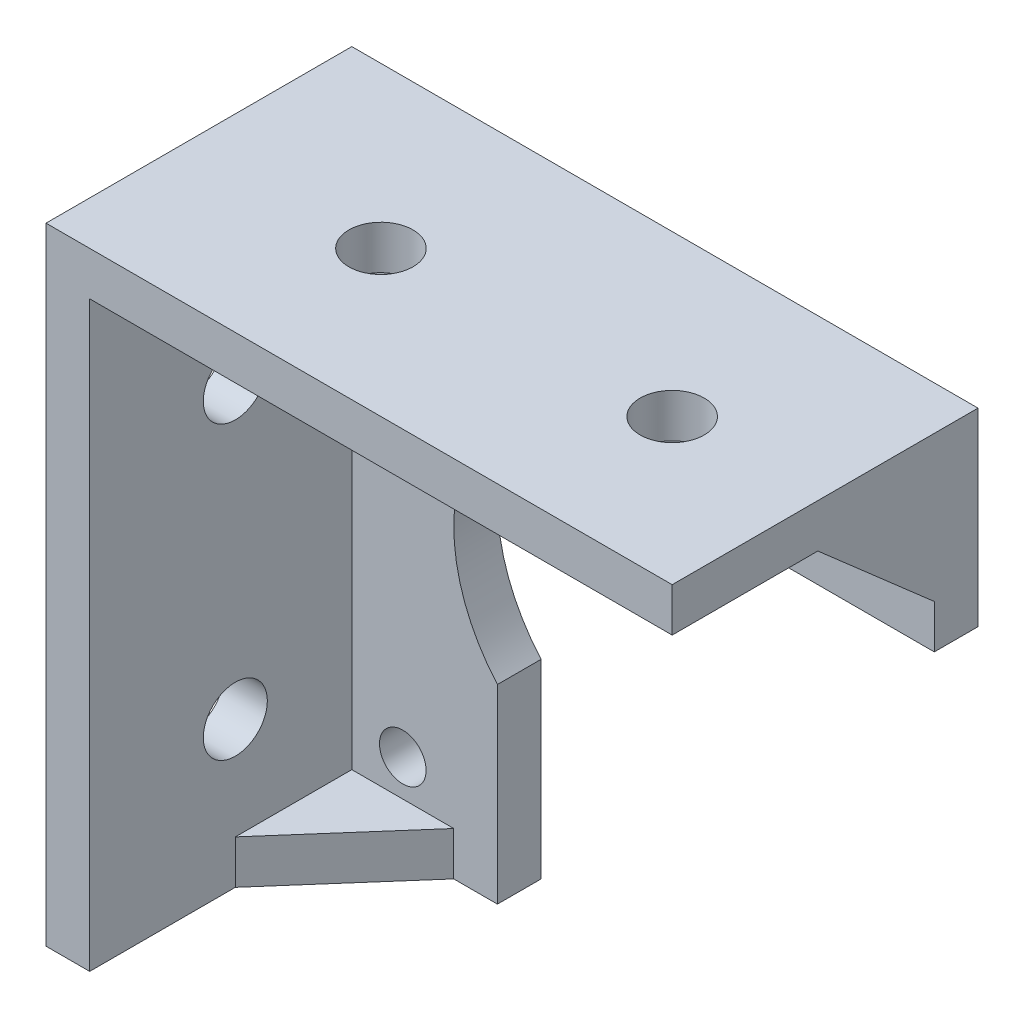
ISO-10303-21;
HEADER;
FILE_DESCRIPTION(('STEP AP214'),'2;1');
FILE_NAME('part.step','',(''),(''),'','','');
FILE_SCHEMA(('AUTOMOTIVE_DESIGN { 1 0 10303 214 1 1 1 1 }'));
ENDSEC;
DATA;
#1=APPLICATION_CONTEXT('core data for automotive mechanical design processes');
#2=APPLICATION_PROTOCOL_DEFINITION('international standard','automotive_design',2000,#1);
#3=PRODUCT_CONTEXT('',#1,'mechanical');
#4=PRODUCT('Part','Part','',(#3));
#5=PRODUCT_RELATED_PRODUCT_CATEGORY('part','',(#4));
#6=PRODUCT_DEFINITION_FORMATION('','',#4);
#7=PRODUCT_DEFINITION_CONTEXT('part definition',#1,'design');
#8=PRODUCT_DEFINITION('design','',#6,#7);
#9=PRODUCT_DEFINITION_SHAPE('','',#8);
#10=(LENGTH_UNIT() NAMED_UNIT(*) SI_UNIT(.MILLI.,.METRE.));
#11=(NAMED_UNIT(*) PLANE_ANGLE_UNIT() SI_UNIT($,.RADIAN.));
#12=(NAMED_UNIT(*) SI_UNIT($,.STERADIAN.) SOLID_ANGLE_UNIT());
#13=UNCERTAINTY_MEASURE_WITH_UNIT(LENGTH_MEASURE(1.E-05),#10,'distance_accuracy_value','');
#14=(GEOMETRIC_REPRESENTATION_CONTEXT(3) GLOBAL_UNCERTAINTY_ASSIGNED_CONTEXT((#13)) GLOBAL_UNIT_ASSIGNED_CONTEXT((#10,
#11,#12)) REPRESENTATION_CONTEXT('',''));
#15=CARTESIAN_POINT('',(0.,0.,0.));
#16=DIRECTION('',(0.,0.,1.));
#17=DIRECTION('',(1.,0.,0.));
#18=AXIS2_PLACEMENT_3D('',#15,#16,#17);
#19=CARTESIAN_POINT('',(0.,0.,3.));
#20=DIRECTION('',(0.,0.,-1.));
#21=DIRECTION('',(-1.,0.,0.));
#22=AXIS2_PLACEMENT_3D('',#19,#20,#21);
#23=PLANE('',#22);
#24=CARTESIAN_POINT('',(6.5,-37.5,3.));
#25=DIRECTION('',(0.,0.,1.));
#26=DIRECTION('',(1.,0.,0.));
#27=AXIS2_PLACEMENT_3D('',#24,#25,#26);
#28=CIRCLE('',#27,1.6);
#29=CARTESIAN_POINT('',(8.1,-37.5,3.));
#30=VERTEX_POINT('',#29);
#31=EDGE_CURVE('E281',#30,#30,#28,.T.);
#32=ORIENTED_EDGE('',*,*,#31,.F.);
#33=EDGE_LOOP('',(#32));
#34=FACE_BOUND('',#33,.T.);
#35=CARTESIAN_POINT('',(37.5,-6.5,3.));
#36=DIRECTION('',(0.,0.,1.));
#37=DIRECTION('',(1.,0.,0.));
#38=AXIS2_PLACEMENT_3D('',#35,#36,#37);
#39=CIRCLE('',#38,1.6);
#40=CARTESIAN_POINT('',(39.1,-6.5,3.));
#41=VERTEX_POINT('',#40);
#42=EDGE_CURVE('E275',#41,#41,#39,.T.);
#43=ORIENTED_EDGE('',*,*,#42,.F.);
#44=EDGE_LOOP('',(#43));
#45=FACE_BOUND('',#44,.T.);
#46=CARTESIAN_POINT('',(6.5,-6.5,3.));
#47=DIRECTION('',(0.,0.,1.));
#48=DIRECTION('',(1.,0.,0.));
#49=AXIS2_PLACEMENT_3D('',#46,#47,#48);
#50=CIRCLE('',#49,1.6);
#51=CARTESIAN_POINT('',(8.1,-6.5,3.));
#52=VERTEX_POINT('',#51);
#53=EDGE_CURVE('E269',#52,#52,#50,.T.);
#54=ORIENTED_EDGE('',*,*,#53,.F.);
#55=EDGE_LOOP('',(#54));
#56=FACE_BOUND('',#55,.T.);
#57=DIRECTION('',(1.,0.,0.));
#58=VECTOR('',#57,1.);
#59=CARTESIAN_POINT('',(10.,-40.,3.));
#60=LINE('',#59,#58);
#61=CARTESIAN_POINT('',(3.,-40.,3.));
#62=VERTEX_POINT('',#61);
#63=CARTESIAN_POINT('',(10.,-40.,3.));
#64=VERTEX_POINT('',#63);
#65=EDGE_CURVE('E52',#62,#64,#60,.T.);
#66=ORIENTED_EDGE('',*,*,#65,.T.);
#67=DIRECTION('',(0.,-1.,0.));
#68=VECTOR('',#67,1.);
#69=CARTESIAN_POINT('',(10.,-40.,3.));
#70=LINE('',#69,#68);
#71=CARTESIAN_POINT('',(10.,-43.,3.));
#72=VERTEX_POINT('',#71);
#73=EDGE_CURVE('E56',#64,#72,#70,.T.);
#74=ORIENTED_EDGE('',*,*,#73,.T.);
#75=DIRECTION('',(1.,0.,0.));
#76=VECTOR('',#75,1.);
#77=CARTESIAN_POINT('',(13.,-43.,3.));
#78=LINE('',#77,#76);
#79=CARTESIAN_POINT('',(13.,-43.,3.));
#80=VERTEX_POINT('',#79);
#81=EDGE_CURVE('E38',#72,#80,#78,.T.);
#82=ORIENTED_EDGE('',*,*,#81,.T.);
#83=DIRECTION('',(0.,1.,0.));
#84=VECTOR('',#83,1.);
#85=CARTESIAN_POINT('',(13.,-43.,3.));
#86=LINE('',#85,#84);
#87=CARTESIAN_POINT('',(13.,-29.9372539331938,3.));
#88=VERTEX_POINT('',#87);
#89=EDGE_CURVE('E181',#80,#88,#86,.T.);
#90=ORIENTED_EDGE('',*,*,#89,.T.);
#91=CARTESIAN_POINT('',(22.,-22.,3.));
#92=DIRECTION('',(0.,0.,1.));
#93=DIRECTION('',(1.,0.,0.));
#94=AXIS2_PLACEMENT_3D('',#91,#92,#93);
#95=CIRCLE('',#94,12.);
#96=CARTESIAN_POINT('',(29.9372539331938,-13.,3.));
#97=VERTEX_POINT('',#96);
#98=EDGE_CURVE('E265',#97,#88,#95,.T.);
#99=ORIENTED_EDGE('',*,*,#98,.F.);
#100=DIRECTION('',(1.,0.,0.));
#101=VECTOR('',#100,1.);
#102=CARTESIAN_POINT('',(43.,-13.,3.));
#103=LINE('',#102,#101);
#104=CARTESIAN_POINT('',(43.,-13.,3.));
#105=VERTEX_POINT('',#104);
#106=EDGE_CURVE('E184',#97,#105,#103,.T.);
#107=ORIENTED_EDGE('',*,*,#106,.T.);
#108=DIRECTION('',(0.,1.,0.));
#109=VECTOR('',#108,1.);
#110=CARTESIAN_POINT('',(43.,0.,3.));
#111=LINE('',#110,#109);
#112=CARTESIAN_POINT('',(43.,-10.,3.));
#113=VERTEX_POINT('',#112);
#114=EDGE_CURVE('E186',#105,#113,#111,.T.);
#115=ORIENTED_EDGE('',*,*,#114,.T.);
#116=DIRECTION('',(1.,0.,0.));
#117=VECTOR('',#116,1.);
#118=CARTESIAN_POINT('',(41.,-10.,3.));
#119=LINE('',#118,#117);
#120=CARTESIAN_POINT('',(41.,-10.,3.));
#121=VERTEX_POINT('',#120);
#122=EDGE_CURVE('E152',#121,#113,#119,.T.);
#123=ORIENTED_EDGE('',*,*,#122,.F.);
#124=DIRECTION('',(0.,1.,0.));
#125=VECTOR('',#124,1.);
#126=CARTESIAN_POINT('',(41.,-3.,3.));
#127=LINE('',#126,#125);
#128=CARTESIAN_POINT('',(41.,-3.,3.));
#129=VERTEX_POINT('',#128);
#130=EDGE_CURVE('E140',#121,#129,#127,.T.);
#131=ORIENTED_EDGE('',*,*,#130,.T.);
#132=DIRECTION('',(1.,0.,0.));
#133=VECTOR('',#132,1.);
#134=CARTESIAN_POINT('',(3.,-3.,3.));
#135=LINE('',#134,#133);
#136=CARTESIAN_POINT('',(3.,-3.,3.));
#137=VERTEX_POINT('',#136);
#138=EDGE_CURVE('E149',#137,#129,#135,.T.);
#139=ORIENTED_EDGE('',*,*,#138,.F.);
#140=DIRECTION('',(0.,1.,0.));
#141=VECTOR('',#140,1.);
#142=CARTESIAN_POINT('',(3.,-43.,3.));
#143=LINE('',#142,#141);
#144=EDGE_CURVE('E160',#62,#137,#143,.T.);
#145=ORIENTED_EDGE('',*,*,#144,.F.);
#146=EDGE_LOOP('',(#66,#74,#82,#90,#99,#107,#115,#123,#131,#139,#145));
#147=FACE_BOUND('',#146,.T.);
#148=ADVANCED_FACE('F34',(#34,#45,#56,#147),#23,.F.);
#149=CARTESIAN_POINT('',(13.,-43.,3.));
#150=DIRECTION('',(0.,1.,0.));
#151=DIRECTION('',(0.,0.,1.));
#152=AXIS2_PLACEMENT_3D('',#149,#150,#151);
#153=PLANE('',#152);
#154=ORIENTED_EDGE('',*,*,#81,.F.);
#155=DIRECTION('',(-0.658504607868518,0.,0.752576694706878));
#156=VECTOR('',#155,1.);
#157=CARTESIAN_POINT('',(3.,-43.,11.));
#158=LINE('',#157,#156);
#159=CARTESIAN_POINT('',(3.,-43.,11.));
#160=VERTEX_POINT('',#159);
#161=EDGE_CURVE('E295',#72,#160,#158,.T.);
#162=ORIENTED_EDGE('',*,*,#161,.T.);
#163=DIRECTION('',(0.,0.,-1.));
#164=VECTOR('',#163,1.);
#165=CARTESIAN_POINT('',(3.,-43.,21.));
#166=LINE('',#165,#164);
#167=CARTESIAN_POINT('',(3.,-43.,21.));
#168=VERTEX_POINT('',#167);
#169=EDGE_CURVE('E178',#168,#160,#166,.T.);
#170=ORIENTED_EDGE('',*,*,#169,.F.);
#171=DIRECTION('',(1.,0.,0.));
#172=VECTOR('',#171,1.);
#173=CARTESIAN_POINT('',(0.,-43.,21.));
#174=LINE('',#173,#172);
#175=CARTESIAN_POINT('',(0.,-43.,21.));
#176=VERTEX_POINT('',#175);
#177=EDGE_CURVE('E163',#176,#168,#174,.T.);
#178=ORIENTED_EDGE('',*,*,#177,.F.);
#179=DIRECTION('',(0.,0.,-1.));
#180=VECTOR('',#179,1.);
#181=CARTESIAN_POINT('',(0.,-43.,3.));
#182=LINE('',#181,#180);
#183=CARTESIAN_POINT('',(0.,-43.,0.));
#184=VERTEX_POINT('',#183);
#185=EDGE_CURVE('E193',#176,#184,#182,.T.);
#186=ORIENTED_EDGE('',*,*,#185,.T.);
#187=DIRECTION('',(1.,0.,0.));
#188=VECTOR('',#187,1.);
#189=CARTESIAN_POINT('',(13.,-43.,0.));
#190=LINE('',#189,#188);
#191=CARTESIAN_POINT('',(13.,-43.,0.));
#192=VERTEX_POINT('',#191);
#193=EDGE_CURVE('E189',#184,#192,#190,.T.);
#194=ORIENTED_EDGE('',*,*,#193,.T.);
#195=DIRECTION('',(0.,0.,-1.));
#196=VECTOR('',#195,1.);
#197=CARTESIAN_POINT('',(13.,-43.,3.));
#198=LINE('',#197,#196);
#199=EDGE_CURVE('E11',#80,#192,#198,.T.);
#200=ORIENTED_EDGE('',*,*,#199,.F.);
#201=EDGE_LOOP('',(#154,#162,#170,#178,#186,#194,#200));
#202=FACE_BOUND('',#201,.T.);
#203=ADVANCED_FACE('F36',(#202),#153,.F.);
#204=CARTESIAN_POINT('',(13.,-43.,3.));
#205=DIRECTION('',(-1.,0.,0.));
#206=DIRECTION('',(0.,-1.,0.));
#207=AXIS2_PLACEMENT_3D('',#204,#205,#206);
#208=PLANE('',#207);
#209=DIRECTION('',(0.,1.,0.));
#210=VECTOR('',#209,1.);
#211=CARTESIAN_POINT('',(13.,-43.,0.));
#212=LINE('',#211,#210);
#213=CARTESIAN_POINT('',(13.,-29.9372539331938,0.));
#214=VERTEX_POINT('',#213);
#215=EDGE_CURVE('E202',#192,#214,#212,.T.);
#216=ORIENTED_EDGE('',*,*,#215,.T.);
#217=DIRECTION('',(0.,0.,1.));
#218=VECTOR('',#217,1.);
#219=CARTESIAN_POINT('',(13.,-29.9372539331938,0.));
#220=LINE('',#219,#218);
#221=EDGE_CURVE('E165',#214,#88,#220,.T.);
#222=ORIENTED_EDGE('',*,*,#221,.T.);
#223=ORIENTED_EDGE('',*,*,#89,.F.);
#224=ORIENTED_EDGE('',*,*,#199,.T.);
#225=EDGE_LOOP('',(#216,#222,#223,#224));
#226=FACE_BOUND('',#225,.T.);
#227=ADVANCED_FACE('F360',(#226),#208,.F.);
#228=CARTESIAN_POINT('',(43.,-13.,3.));
#229=DIRECTION('',(0.,1.,0.));
#230=DIRECTION('',(-1.,0.,0.));
#231=AXIS2_PLACEMENT_3D('',#228,#229,#230);
#232=PLANE('',#231);
#233=ORIENTED_EDGE('',*,*,#106,.F.);
#234=DIRECTION('',(0.,0.,1.));
#235=VECTOR('',#234,1.);
#236=CARTESIAN_POINT('',(29.9372539331938,-13.,0.));
#237=LINE('',#236,#235);
#238=CARTESIAN_POINT('',(29.9372539331938,-13.,0.));
#239=VERTEX_POINT('',#238);
#240=EDGE_CURVE('E261',#97,#239,#237,.F.);
#241=ORIENTED_EDGE('',*,*,#240,.T.);
#242=DIRECTION('',(1.,0.,0.));
#243=VECTOR('',#242,1.);
#244=CARTESIAN_POINT('',(43.,-13.,0.));
#245=LINE('',#244,#243);
#246=CARTESIAN_POINT('',(43.,-13.,0.));
#247=VERTEX_POINT('',#246);
#248=EDGE_CURVE('E208',#239,#247,#245,.T.);
#249=ORIENTED_EDGE('',*,*,#248,.T.);
#250=DIRECTION('',(0.,0.,-1.));
#251=VECTOR('',#250,1.);
#252=CARTESIAN_POINT('',(43.,-13.,3.));
#253=LINE('',#252,#251);
#254=EDGE_CURVE('E44',#105,#247,#253,.T.);
#255=ORIENTED_EDGE('',*,*,#254,.F.);
#256=EDGE_LOOP('',(#233,#241,#249,#255));
#257=FACE_BOUND('',#256,.T.);
#258=ADVANCED_FACE('F375',(#257),#232,.F.);
#259=CARTESIAN_POINT('',(43.,0.,3.));
#260=DIRECTION('',(-1.,0.,0.));
#261=DIRECTION('',(0.,0.,1.));
#262=AXIS2_PLACEMENT_3D('',#259,#260,#261);
#263=PLANE('',#262);
#264=DIRECTION('',(0.,1.,0.));
#265=VECTOR('',#264,1.);
#266=CARTESIAN_POINT('',(43.,0.,0.));
#267=LINE('',#266,#265);
#268=CARTESIAN_POINT('',(43.,0.,0.));
#269=VERTEX_POINT('',#268);
#270=EDGE_CURVE('E211',#247,#269,#267,.T.);
#271=ORIENTED_EDGE('',*,*,#270,.T.);
#272=DIRECTION('',(0.,0.,-1.));
#273=VECTOR('',#272,1.);
#274=CARTESIAN_POINT('',(43.,0.,3.));
#275=LINE('',#274,#273);
#276=CARTESIAN_POINT('',(43.,0.,21.));
#277=VERTEX_POINT('',#276);
#278=EDGE_CURVE('E223',#277,#269,#275,.T.);
#279=ORIENTED_EDGE('',*,*,#278,.F.);
#280=DIRECTION('',(0.,1.,0.));
#281=VECTOR('',#280,1.);
#282=CARTESIAN_POINT('',(43.,-3.,21.));
#283=LINE('',#282,#281);
#284=CARTESIAN_POINT('',(43.,-3.,21.));
#285=VERTEX_POINT('',#284);
#286=EDGE_CURVE('E252',#285,#277,#283,.T.);
#287=ORIENTED_EDGE('',*,*,#286,.F.);
#288=DIRECTION('',(0.,0.,-1.));
#289=VECTOR('',#288,1.);
#290=CARTESIAN_POINT('',(43.,-3.,21.));
#291=LINE('',#290,#289);
#292=CARTESIAN_POINT('',(43.,-3.,11.));
#293=VERTEX_POINT('',#292);
#294=EDGE_CURVE('E171',#285,#293,#291,.T.);
#295=ORIENTED_EDGE('',*,*,#294,.T.);
#296=DIRECTION('',(0.,-0.658504607868518,-0.752576694706878));
#297=VECTOR('',#296,1.);
#298=CARTESIAN_POINT('',(43.,-10.,3.));
#299=LINE('',#298,#297);
#300=EDGE_CURVE('E153',#293,#113,#299,.T.);
#301=ORIENTED_EDGE('',*,*,#300,.T.);
#302=ORIENTED_EDGE('',*,*,#114,.F.);
#303=ORIENTED_EDGE('',*,*,#254,.T.);
#304=EDGE_LOOP('',(#271,#279,#287,#295,#301,#302,#303));
#305=FACE_BOUND('',#304,.T.);
#306=ADVANCED_FACE('F230',(#305),#263,.F.);
#307=CARTESIAN_POINT('',(0.,0.,3.));
#308=DIRECTION('',(0.,-1.,0.));
#309=DIRECTION('',(0.,0.,-1.));
#310=AXIS2_PLACEMENT_3D('',#307,#308,#309);
#311=PLANE('',#310);
#312=CARTESIAN_POINT('',(33.,0.,11.));
#313=DIRECTION('',(0.,-1.,0.));
#314=DIRECTION('',(0.,0.,-1.));
#315=AXIS2_PLACEMENT_3D('',#312,#313,#314);
#316=CIRCLE('',#315,2.19999999999999);
#317=CARTESIAN_POINT('',(33.,0.,8.80000000000001));
#318=VERTEX_POINT('',#317);
#319=EDGE_CURVE('E307',#318,#318,#316,.T.);
#320=ORIENTED_EDGE('',*,*,#319,.T.);
#321=EDGE_LOOP('',(#320));
#322=FACE_BOUND('',#321,.T.);
#323=CARTESIAN_POINT('',(13.,0.,11.));
#324=DIRECTION('',(0.,-1.,0.));
#325=DIRECTION('',(0.,0.,-1.));
#326=AXIS2_PLACEMENT_3D('',#323,#324,#325);
#327=CIRCLE('',#326,2.2);
#328=CARTESIAN_POINT('',(13.,0.,8.8));
#329=VERTEX_POINT('',#328);
#330=EDGE_CURVE('E299',#329,#329,#327,.T.);
#331=ORIENTED_EDGE('',*,*,#330,.T.);
#332=EDGE_LOOP('',(#331));
#333=FACE_BOUND('',#332,.T.);
#334=DIRECTION('',(-1.,0.,0.));
#335=VECTOR('',#334,1.);
#336=CARTESIAN_POINT('',(0.,0.,0.));
#337=LINE('',#336,#335);
#338=CARTESIAN_POINT('',(0.,0.,0.));
#339=VERTEX_POINT('',#338);
#340=EDGE_CURVE('E215',#269,#339,#337,.T.);
#341=ORIENTED_EDGE('',*,*,#340,.T.);
#342=DIRECTION('',(0.,0.,-1.));
#343=VECTOR('',#342,1.);
#344=CARTESIAN_POINT('',(0.,0.,3.));
#345=LINE('',#344,#343);
#346=CARTESIAN_POINT('',(0.,0.,21.));
#347=VERTEX_POINT('',#346);
#348=EDGE_CURVE('E220',#347,#339,#345,.T.);
#349=ORIENTED_EDGE('',*,*,#348,.F.);
#350=DIRECTION('',(-1.,0.,0.));
#351=VECTOR('',#350,1.);
#352=CARTESIAN_POINT('',(43.,0.,21.));
#353=LINE('',#352,#351);
#354=EDGE_CURVE('E176',#277,#347,#353,.T.);
#355=ORIENTED_EDGE('',*,*,#354,.F.);
#356=ORIENTED_EDGE('',*,*,#278,.T.);
#357=EDGE_LOOP('',(#341,#349,#355,#356));
#358=FACE_BOUND('',#357,.T.);
#359=ADVANCED_FACE('F241',(#322,#333,#358),#311,.F.);
#360=CARTESIAN_POINT('',(0.,-43.,3.));
#361=DIRECTION('',(1.,0.,0.));
#362=DIRECTION('',(0.,0.,-1.));
#363=AXIS2_PLACEMENT_3D('',#360,#361,#362);
#364=PLANE('',#363);
#365=CARTESIAN_POINT('',(0.,-13.,11.));
#366=DIRECTION('',(1.,0.,0.));
#367=DIRECTION('',(0.,0.,-1.));
#368=AXIS2_PLACEMENT_3D('',#365,#366,#367);
#369=CIRCLE('',#368,2.2);
#370=CARTESIAN_POINT('',(0.,-13.,8.8));
#371=VERTEX_POINT('',#370);
#372=EDGE_CURVE('E319',#371,#371,#369,.T.);
#373=ORIENTED_EDGE('',*,*,#372,.T.);
#374=EDGE_LOOP('',(#373));
#375=FACE_BOUND('',#374,.T.);
#376=CARTESIAN_POINT('',(0.,-33.,11.));
#377=DIRECTION('',(1.,0.,0.));
#378=DIRECTION('',(0.,0.,-1.));
#379=AXIS2_PLACEMENT_3D('',#376,#377,#378);
#380=CIRCLE('',#379,2.2);
#381=CARTESIAN_POINT('',(0.,-33.,8.8));
#382=VERTEX_POINT('',#381);
#383=EDGE_CURVE('E313',#382,#382,#380,.T.);
#384=ORIENTED_EDGE('',*,*,#383,.T.);
#385=EDGE_LOOP('',(#384));
#386=FACE_BOUND('',#385,.T.);
#387=DIRECTION('',(0.,-1.,0.));
#388=VECTOR('',#387,1.);
#389=CARTESIAN_POINT('',(0.,-43.,0.));
#390=LINE('',#389,#388);
#391=EDGE_CURVE('E217',#339,#184,#390,.T.);
#392=ORIENTED_EDGE('',*,*,#391,.T.);
#393=ORIENTED_EDGE('',*,*,#185,.F.);
#394=DIRECTION('',(0.,-1.,0.));
#395=VECTOR('',#394,1.);
#396=CARTESIAN_POINT('',(0.,0.,21.));
#397=LINE('',#396,#395);
#398=EDGE_CURVE('E159',#347,#176,#397,.T.);
#399=ORIENTED_EDGE('',*,*,#398,.F.);
#400=ORIENTED_EDGE('',*,*,#348,.T.);
#401=EDGE_LOOP('',(#392,#393,#399,#400));
#402=FACE_BOUND('',#401,.T.);
#403=ADVANCED_FACE('F246',(#375,#386,#402),#364,.F.);
#404=CARTESIAN_POINT('',(0.,0.,0.));
#405=DIRECTION('',(0.,0.,-1.));
#406=DIRECTION('',(-1.,0.,0.));
#407=AXIS2_PLACEMENT_3D('',#404,#405,#406);
#408=PLANE('',#407);
#409=CARTESIAN_POINT('',(6.5,-37.5,0.));
#410=DIRECTION('',(0.,0.,1.));
#411=DIRECTION('',(1.,0.,0.));
#412=AXIS2_PLACEMENT_3D('',#409,#410,#411);
#413=CIRCLE('',#412,1.6);
#414=CARTESIAN_POINT('',(8.1,-37.5,0.));
#415=VERTEX_POINT('',#414);
#416=EDGE_CURVE('E278',#415,#415,#413,.T.);
#417=ORIENTED_EDGE('',*,*,#416,.T.);
#418=EDGE_LOOP('',(#417));
#419=FACE_BOUND('',#418,.T.);
#420=CARTESIAN_POINT('',(37.5,-6.5,0.));
#421=DIRECTION('',(0.,0.,1.));
#422=DIRECTION('',(1.,0.,0.));
#423=AXIS2_PLACEMENT_3D('',#420,#421,#422);
#424=CIRCLE('',#423,1.6);
#425=CARTESIAN_POINT('',(39.1,-6.5,0.));
#426=VERTEX_POINT('',#425);
#427=EDGE_CURVE('E272',#426,#426,#424,.T.);
#428=ORIENTED_EDGE('',*,*,#427,.T.);
#429=EDGE_LOOP('',(#428));
#430=FACE_BOUND('',#429,.T.);
#431=CARTESIAN_POINT('',(6.5,-6.5,0.));
#432=DIRECTION('',(0.,0.,1.));
#433=DIRECTION('',(1.,0.,0.));
#434=AXIS2_PLACEMENT_3D('',#431,#432,#433);
#435=CIRCLE('',#434,1.6);
#436=CARTESIAN_POINT('',(8.1,-6.5,0.));
#437=VERTEX_POINT('',#436);
#438=EDGE_CURVE('E267',#437,#437,#435,.T.);
#439=ORIENTED_EDGE('',*,*,#438,.T.);
#440=EDGE_LOOP('',(#439));
#441=FACE_BOUND('',#440,.T.);
#442=CARTESIAN_POINT('',(22.,-22.,0.));
#443=DIRECTION('',(0.,0.,1.));
#444=DIRECTION('',(1.,0.,0.));
#445=AXIS2_PLACEMENT_3D('',#442,#443,#444);
#446=CIRCLE('',#445,12.);
#447=EDGE_CURVE('E264',#239,#214,#446,.T.);
#448=ORIENTED_EDGE('',*,*,#447,.T.);
#449=ORIENTED_EDGE('',*,*,#215,.F.);
#450=ORIENTED_EDGE('',*,*,#193,.F.);
#451=ORIENTED_EDGE('',*,*,#391,.F.);
#452=ORIENTED_EDGE('',*,*,#340,.F.);
#453=ORIENTED_EDGE('',*,*,#270,.F.);
#454=ORIENTED_EDGE('',*,*,#248,.F.);
#455=EDGE_LOOP('',(#448,#449,#450,#451,#452,#453,#454));
#456=FACE_BOUND('',#455,.T.);
#457=ADVANCED_FACE('F238',(#419,#430,#441,#456),#408,.T.);
#458=CARTESIAN_POINT('',(3.,-43.,21.));
#459=DIRECTION('',(-1.,0.,0.));
#460=DIRECTION('',(0.,0.,1.));
#461=AXIS2_PLACEMENT_3D('',#458,#459,#460);
#462=PLANE('',#461);
#463=CARTESIAN_POINT('',(3.,-13.,11.));
#464=DIRECTION('',(1.,0.,0.));
#465=DIRECTION('',(0.,0.,-1.));
#466=AXIS2_PLACEMENT_3D('',#463,#464,#465);
#467=CIRCLE('',#466,2.2);
#468=CARTESIAN_POINT('',(3.,-13.,8.8));
#469=VERTEX_POINT('',#468);
#470=EDGE_CURVE('E322',#469,#469,#467,.T.);
#471=ORIENTED_EDGE('',*,*,#470,.F.);
#472=EDGE_LOOP('',(#471));
#473=FACE_BOUND('',#472,.T.);
#474=CARTESIAN_POINT('',(3.,-33.,11.));
#475=DIRECTION('',(1.,0.,0.));
#476=DIRECTION('',(0.,0.,-1.));
#477=AXIS2_PLACEMENT_3D('',#474,#475,#476);
#478=CIRCLE('',#477,2.2);
#479=CARTESIAN_POINT('',(3.,-33.,8.8));
#480=VERTEX_POINT('',#479);
#481=EDGE_CURVE('E316',#480,#480,#478,.T.);
#482=ORIENTED_EDGE('',*,*,#481,.F.);
#483=EDGE_LOOP('',(#482));
#484=FACE_BOUND('',#483,.T.);
#485=ORIENTED_EDGE('',*,*,#169,.T.);
#486=DIRECTION('',(0.,-1.,0.));
#487=VECTOR('',#486,1.);
#488=CARTESIAN_POINT('',(3.,-40.,11.));
#489=LINE('',#488,#487);
#490=CARTESIAN_POINT('',(3.,-40.,11.));
#491=VERTEX_POINT('',#490);
#492=EDGE_CURVE('E290',#491,#160,#489,.T.);
#493=ORIENTED_EDGE('',*,*,#492,.F.);
#494=DIRECTION('',(0.,0.,-1.));
#495=VECTOR('',#494,1.);
#496=CARTESIAN_POINT('',(3.00000000000001,-40.,3.));
#497=LINE('',#496,#495);
#498=EDGE_CURVE('E298',#491,#62,#497,.T.);
#499=ORIENTED_EDGE('',*,*,#498,.T.);
#500=ORIENTED_EDGE('',*,*,#144,.T.);
#501=DIRECTION('',(0.,0.,-1.));
#502=VECTOR('',#501,1.);
#503=CARTESIAN_POINT('',(3.,-3.,21.));
#504=LINE('',#503,#502);
#505=CARTESIAN_POINT('',(3.,-3.,21.));
#506=VERTEX_POINT('',#505);
#507=EDGE_CURVE('E158',#506,#137,#504,.T.);
#508=ORIENTED_EDGE('',*,*,#507,.F.);
#509=DIRECTION('',(0.,1.,0.));
#510=VECTOR('',#509,1.);
#511=CARTESIAN_POINT('',(3.,-43.,21.));
#512=LINE('',#511,#510);
#513=EDGE_CURVE('E255',#168,#506,#512,.T.);
#514=ORIENTED_EDGE('',*,*,#513,.F.);
#515=EDGE_LOOP('',(#485,#493,#499,#500,#508,#514));
#516=FACE_BOUND('',#515,.T.);
#517=ADVANCED_FACE('F337',(#473,#484,#516),#462,.F.);
#518=CARTESIAN_POINT('',(3.,-3.,21.));
#519=DIRECTION('',(0.,1.,0.));
#520=DIRECTION('',(0.,0.,1.));
#521=AXIS2_PLACEMENT_3D('',#518,#519,#520);
#522=PLANE('',#521);
#523=CARTESIAN_POINT('',(33.,-3.,11.));
#524=DIRECTION('',(0.,-1.,0.));
#525=DIRECTION('',(0.,0.,-1.));
#526=AXIS2_PLACEMENT_3D('',#523,#524,#525);
#527=CIRCLE('',#526,2.19999999999999);
#528=CARTESIAN_POINT('',(33.,-3.,8.80000000000001));
#529=VERTEX_POINT('',#528);
#530=EDGE_CURVE('E310',#529,#529,#527,.T.);
#531=ORIENTED_EDGE('',*,*,#530,.F.);
#532=EDGE_LOOP('',(#531));
#533=FACE_BOUND('',#532,.T.);
#534=CARTESIAN_POINT('',(13.,-3.,11.));
#535=DIRECTION('',(0.,-1.,0.));
#536=DIRECTION('',(0.,0.,-1.));
#537=AXIS2_PLACEMENT_3D('',#534,#535,#536);
#538=CIRCLE('',#537,2.2);
#539=CARTESIAN_POINT('',(13.,-3.,8.8));
#540=VERTEX_POINT('',#539);
#541=EDGE_CURVE('E304',#540,#540,#538,.T.);
#542=ORIENTED_EDGE('',*,*,#541,.F.);
#543=EDGE_LOOP('',(#542));
#544=FACE_BOUND('',#543,.T.);
#545=DIRECTION('',(0.,0.,1.));
#546=VECTOR('',#545,1.);
#547=CARTESIAN_POINT('',(41.,-3.,11.));
#548=LINE('',#547,#546);
#549=CARTESIAN_POINT('',(41.,-3.,11.));
#550=VERTEX_POINT('',#549);
#551=EDGE_CURVE('E137',#129,#550,#548,.T.);
#552=ORIENTED_EDGE('',*,*,#551,.T.);
#553=DIRECTION('',(1.,0.,0.));
#554=VECTOR('',#553,1.);
#555=CARTESIAN_POINT('',(41.,-3.,11.));
#556=LINE('',#555,#554);
#557=EDGE_CURVE('E286',#550,#293,#556,.T.);
#558=ORIENTED_EDGE('',*,*,#557,.T.);
#559=ORIENTED_EDGE('',*,*,#294,.F.);
#560=DIRECTION('',(1.,0.,0.));
#561=VECTOR('',#560,1.);
#562=CARTESIAN_POINT('',(3.,-3.,21.));
#563=LINE('',#562,#561);
#564=EDGE_CURVE('E254',#506,#285,#563,.T.);
#565=ORIENTED_EDGE('',*,*,#564,.F.);
#566=ORIENTED_EDGE('',*,*,#507,.T.);
#567=ORIENTED_EDGE('',*,*,#138,.T.);
#568=EDGE_LOOP('',(#552,#558,#559,#565,#566,#567));
#569=FACE_BOUND('',#568,.T.);
#570=ADVANCED_FACE('F155',(#533,#544,#569),#522,.F.);
#571=CARTESIAN_POINT('',(0.,0.,21.));
#572=DIRECTION('',(0.,0.,1.));
#573=DIRECTION('',(1.,0.,0.));
#574=AXIS2_PLACEMENT_3D('',#571,#572,#573);
#575=PLANE('',#574);
#576=ORIENTED_EDGE('',*,*,#398,.T.);
#577=ORIENTED_EDGE('',*,*,#177,.T.);
#578=ORIENTED_EDGE('',*,*,#513,.T.);
#579=ORIENTED_EDGE('',*,*,#564,.T.);
#580=ORIENTED_EDGE('',*,*,#286,.T.);
#581=ORIENTED_EDGE('',*,*,#354,.T.);
#582=EDGE_LOOP('',(#576,#577,#578,#579,#580,#581));
#583=FACE_BOUND('',#582,.T.);
#584=ADVANCED_FACE('F249',(#583),#575,.T.);
#585=CARTESIAN_POINT('',(22.,-22.,0.));
#586=DIRECTION('',(0.,0.,1.));
#587=DIRECTION('',(1.,0.,0.));
#588=AXIS2_PLACEMENT_3D('',#585,#586,#587);
#589=CYLINDRICAL_SURFACE('',#588,12.);
#590=ORIENTED_EDGE('',*,*,#447,.F.);
#591=ORIENTED_EDGE('',*,*,#240,.F.);
#592=ORIENTED_EDGE('',*,*,#98,.T.);
#593=ORIENTED_EDGE('',*,*,#221,.F.);
#594=EDGE_LOOP('',(#590,#591,#592,#593));
#595=FACE_BOUND('',#594,.T.);
#596=ADVANCED_FACE('F425',(#595),#589,.F.);
#597=CARTESIAN_POINT('',(6.5,-6.5,0.));
#598=DIRECTION('',(0.,0.,1.));
#599=DIRECTION('',(1.,0.,0.));
#600=AXIS2_PLACEMENT_3D('',#597,#598,#599);
#601=CYLINDRICAL_SURFACE('',#600,1.6);
#602=ORIENTED_EDGE('',*,*,#438,.F.);
#603=EDGE_LOOP('',(#602));
#604=FACE_BOUND('',#603,.T.);
#605=ORIENTED_EDGE('',*,*,#53,.T.);
#606=EDGE_LOOP('',(#605));
#607=FACE_BOUND('',#606,.T.);
#608=ADVANCED_FACE('F431',(#604,#607),#601,.F.);
#609=CARTESIAN_POINT('',(37.5,-6.5,0.));
#610=DIRECTION('',(0.,0.,1.));
#611=DIRECTION('',(1.,0.,0.));
#612=AXIS2_PLACEMENT_3D('',#609,#610,#611);
#613=CYLINDRICAL_SURFACE('',#612,1.6);
#614=ORIENTED_EDGE('',*,*,#427,.F.);
#615=EDGE_LOOP('',(#614));
#616=FACE_BOUND('',#615,.T.);
#617=ORIENTED_EDGE('',*,*,#42,.T.);
#618=EDGE_LOOP('',(#617));
#619=FACE_BOUND('',#618,.T.);
#620=ADVANCED_FACE('F438',(#616,#619),#613,.F.);
#621=CARTESIAN_POINT('',(6.5,-37.5,0.));
#622=DIRECTION('',(0.,0.,1.));
#623=DIRECTION('',(1.,0.,0.));
#624=AXIS2_PLACEMENT_3D('',#621,#622,#623);
#625=CYLINDRICAL_SURFACE('',#624,1.6);
#626=ORIENTED_EDGE('',*,*,#416,.F.);
#627=EDGE_LOOP('',(#626));
#628=FACE_BOUND('',#627,.T.);
#629=ORIENTED_EDGE('',*,*,#31,.T.);
#630=EDGE_LOOP('',(#629));
#631=FACE_BOUND('',#630,.T.);
#632=ADVANCED_FACE('F446',(#628,#631),#625,.F.);
#633=CARTESIAN_POINT('',(41.,-10.,3.));
#634=DIRECTION('',(0.,-0.752576694706878,0.658504607868518));
#635=DIRECTION('',(0.,-0.658504607868518,-0.752576694706878));
#636=AXIS2_PLACEMENT_3D('',#633,#634,#635);
#637=PLANE('',#636);
#638=ORIENTED_EDGE('',*,*,#300,.F.);
#639=ORIENTED_EDGE('',*,*,#557,.F.);
#640=DIRECTION('',(0.,-0.658504607868518,-0.752576694706878));
#641=VECTOR('',#640,1.);
#642=CARTESIAN_POINT('',(41.,-10.,3.));
#643=LINE('',#642,#641);
#644=EDGE_CURVE('E142',#550,#121,#643,.T.);
#645=ORIENTED_EDGE('',*,*,#644,.T.);
#646=ORIENTED_EDGE('',*,*,#122,.T.);
#647=EDGE_LOOP('',(#638,#639,#645,#646));
#648=FACE_BOUND('',#647,.T.);
#649=ADVANCED_FACE('F453',(#648),#637,.T.);
#650=CARTESIAN_POINT('',(41.,0.,0.));
#651=DIRECTION('',(1.,0.,0.));
#652=DIRECTION('',(0.,0.,-1.));
#653=AXIS2_PLACEMENT_3D('',#650,#651,#652);
#654=PLANE('',#653);
#655=ORIENTED_EDGE('',*,*,#130,.F.);
#656=ORIENTED_EDGE('',*,*,#644,.F.);
#657=ORIENTED_EDGE('',*,*,#551,.F.);
#658=EDGE_LOOP('',(#655,#656,#657));
#659=FACE_BOUND('',#658,.T.);
#660=ADVANCED_FACE('F139',(#659),#654,.F.);
#661=CARTESIAN_POINT('',(3.,-40.,11.));
#662=DIRECTION('',(0.752576694706878,0.,0.658504607868518));
#663=DIRECTION('',(0.658504607868518,0.,-0.752576694706878));
#664=AXIS2_PLACEMENT_3D('',#661,#662,#663);
#665=PLANE('',#664);
#666=ORIENTED_EDGE('',*,*,#161,.F.);
#667=ORIENTED_EDGE('',*,*,#73,.F.);
#668=DIRECTION('',(-0.658504607868518,0.,0.752576694706878));
#669=VECTOR('',#668,1.);
#670=CARTESIAN_POINT('',(3.,-40.,11.));
#671=LINE('',#670,#669);
#672=EDGE_CURVE('E293',#64,#491,#671,.T.);
#673=ORIENTED_EDGE('',*,*,#672,.T.);
#674=ORIENTED_EDGE('',*,*,#492,.T.);
#675=EDGE_LOOP('',(#666,#667,#673,#674));
#676=FACE_BOUND('',#675,.T.);
#677=ADVANCED_FACE('F467',(#676),#665,.T.);
#678=CARTESIAN_POINT('',(0.,-40.,0.));
#679=DIRECTION('',(0.,-1.,0.));
#680=DIRECTION('',(0.,0.,-1.));
#681=AXIS2_PLACEMENT_3D('',#678,#679,#680);
#682=PLANE('',#681);
#683=ORIENTED_EDGE('',*,*,#498,.F.);
#684=ORIENTED_EDGE('',*,*,#672,.F.);
#685=ORIENTED_EDGE('',*,*,#65,.F.);
#686=EDGE_LOOP('',(#683,#684,#685));
#687=FACE_BOUND('',#686,.T.);
#688=ADVANCED_FACE('F474',(#687),#682,.F.);
#689=CARTESIAN_POINT('',(13.,0.,11.));
#690=DIRECTION('',(0.,-1.,0.));
#691=DIRECTION('',(0.,0.,-1.));
#692=AXIS2_PLACEMENT_3D('',#689,#690,#691);
#693=CYLINDRICAL_SURFACE('',#692,2.2);
#694=ORIENTED_EDGE('',*,*,#330,.F.);
#695=EDGE_LOOP('',(#694));
#696=FACE_BOUND('',#695,.T.);
#697=ORIENTED_EDGE('',*,*,#541,.T.);
#698=EDGE_LOOP('',(#697));
#699=FACE_BOUND('',#698,.T.);
#700=ADVANCED_FACE('F350',(#696,#699),#693,.F.);
#701=CARTESIAN_POINT('',(33.,0.,11.));
#702=DIRECTION('',(0.,-1.,0.));
#703=DIRECTION('',(0.,0.,-1.));
#704=AXIS2_PLACEMENT_3D('',#701,#702,#703);
#705=CYLINDRICAL_SURFACE('',#704,2.19999999999999);
#706=ORIENTED_EDGE('',*,*,#319,.F.);
#707=EDGE_LOOP('',(#706));
#708=FACE_BOUND('',#707,.T.);
#709=ORIENTED_EDGE('',*,*,#530,.T.);
#710=EDGE_LOOP('',(#709));
#711=FACE_BOUND('',#710,.T.);
#712=ADVANCED_FACE('F344',(#708,#711),#705,.F.);
#713=CARTESIAN_POINT('',(0.,-33.,11.));
#714=DIRECTION('',(1.,0.,0.));
#715=DIRECTION('',(0.,0.,-1.));
#716=AXIS2_PLACEMENT_3D('',#713,#714,#715);
#717=CYLINDRICAL_SURFACE('',#716,2.2);
#718=ORIENTED_EDGE('',*,*,#383,.F.);
#719=EDGE_LOOP('',(#718));
#720=FACE_BOUND('',#719,.T.);
#721=ORIENTED_EDGE('',*,*,#481,.T.);
#722=EDGE_LOOP('',(#721));
#723=FACE_BOUND('',#722,.T.);
#724=ADVANCED_FACE('F333',(#720,#723),#717,.F.);
#725=CARTESIAN_POINT('',(0.,-13.,11.));
#726=DIRECTION('',(1.,0.,0.));
#727=DIRECTION('',(0.,0.,-1.));
#728=AXIS2_PLACEMENT_3D('',#725,#726,#727);
#729=CYLINDRICAL_SURFACE('',#728,2.2);
#730=ORIENTED_EDGE('',*,*,#372,.F.);
#731=EDGE_LOOP('',(#730));
#732=FACE_BOUND('',#731,.T.);
#733=ORIENTED_EDGE('',*,*,#470,.T.);
#734=EDGE_LOOP('',(#733));
#735=FACE_BOUND('',#734,.T.);
#736=ADVANCED_FACE('F330',(#732,#735),#729,.F.);
#737=CLOSED_SHELL('',(#148,#203,#227,#258,#306,#359,#403,#457,#517,#570,#584,#596,#608,#620,
#632,#649,#660,#677,#688,#700,#712,#724,#736));
#738=MANIFOLD_SOLID_BREP('B2',#737);
#739=ADVANCED_BREP_SHAPE_REPRESENTATION('',(#18,#738),#14);
#740=SHAPE_DEFINITION_REPRESENTATION(#9,#739);
ENDSEC;
END-ISO-10303-21;
